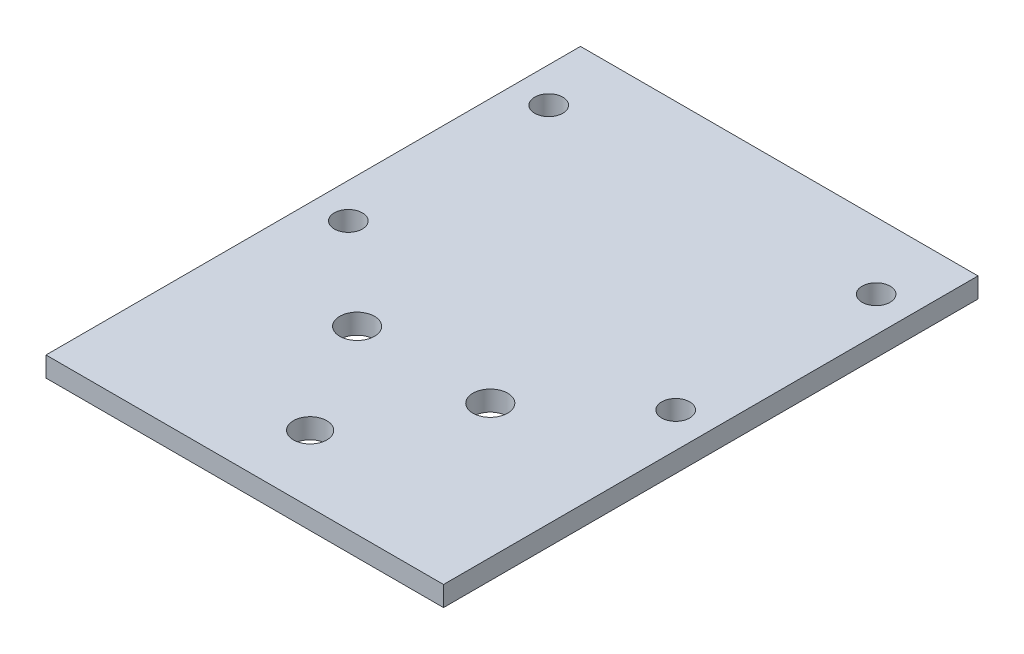
ISO-10303-21;
HEADER;
FILE_DESCRIPTION(('STEP AP214'),'2;1');
FILE_NAME('part.step','',(''),(''),'','','');
FILE_SCHEMA(('AUTOMOTIVE_DESIGN { 1 0 10303 214 1 1 1 1 }'));
ENDSEC;
DATA;
#1=APPLICATION_CONTEXT('core data for automotive mechanical design processes');
#2=APPLICATION_PROTOCOL_DEFINITION('international standard','automotive_design',2000,#1);
#3=PRODUCT_CONTEXT('',#1,'mechanical');
#4=PRODUCT('Part','Part','',(#3));
#5=PRODUCT_RELATED_PRODUCT_CATEGORY('part','',(#4));
#6=PRODUCT_DEFINITION_FORMATION('','',#4);
#7=PRODUCT_DEFINITION_CONTEXT('part definition',#1,'design');
#8=PRODUCT_DEFINITION('design','',#6,#7);
#9=PRODUCT_DEFINITION_SHAPE('','',#8);
#10=(LENGTH_UNIT() NAMED_UNIT(*) SI_UNIT(.MILLI.,.METRE.));
#11=(NAMED_UNIT(*) PLANE_ANGLE_UNIT() SI_UNIT($,.RADIAN.));
#12=(NAMED_UNIT(*) SI_UNIT($,.STERADIAN.) SOLID_ANGLE_UNIT());
#13=UNCERTAINTY_MEASURE_WITH_UNIT(LENGTH_MEASURE(1.E-05),#10,'distance_accuracy_value','');
#14=(GEOMETRIC_REPRESENTATION_CONTEXT(3) GLOBAL_UNCERTAINTY_ASSIGNED_CONTEXT((#13)) GLOBAL_UNIT_ASSIGNED_CONTEXT((#10,
#11,#12)) REPRESENTATION_CONTEXT('',''));
#15=CARTESIAN_POINT('',(0.,0.,0.));
#16=DIRECTION('',(0.,0.,1.));
#17=DIRECTION('',(1.,0.,0.));
#18=AXIS2_PLACEMENT_3D('',#15,#16,#17);
#19=CARTESIAN_POINT('',(0.,3.,0.));
#20=DIRECTION('',(0.,1.,0.));
#21=DIRECTION('',(0.,0.,1.));
#22=AXIS2_PLACEMENT_3D('',#19,#20,#21);
#23=PLANE('',#22);
#24=CARTESIAN_POINT('',(-0.216251762801351,3.,29.9999999999999));
#25=DIRECTION('',(0.,1.,0.));
#26=DIRECTION('',(0.,0.,1.));
#27=AXIS2_PLACEMENT_3D('',#24,#25,#26);
#28=CIRCLE('',#27,2.5);
#29=CARTESIAN_POINT('',(-0.216251762801351,3.,32.4999999999999));
#30=VERTEX_POINT('',#29);
#31=EDGE_CURVE('E145',#30,#30,#28,.T.);
#32=ORIENTED_EDGE('',*,*,#31,.F.);
#33=EDGE_LOOP('',(#32));
#34=FACE_BOUND('',#33,.T.);
#35=CARTESIAN_POINT('',(9.75000000000001,3.,12.9999999999999));
#36=DIRECTION('',(0.,1.,0.));
#37=DIRECTION('',(0.,0.,1.));
#38=AXIS2_PLACEMENT_3D('',#35,#36,#37);
#39=CIRCLE('',#38,2.6);
#40=CARTESIAN_POINT('',(9.75000000000001,3.,15.5999999999999));
#41=VERTEX_POINT('',#40);
#42=EDGE_CURVE('E133',#41,#41,#39,.T.);
#43=ORIENTED_EDGE('',*,*,#42,.F.);
#44=EDGE_LOOP('',(#43));
#45=FACE_BOUND('',#44,.T.);
#46=CARTESIAN_POINT('',(-24.5,3.,0.));
#47=DIRECTION('',(0.,1.,0.));
#48=DIRECTION('',(0.,0.,-1.));
#49=AXIS2_PLACEMENT_3D('',#46,#47,#48);
#50=CIRCLE('',#49,2.1);
#51=CARTESIAN_POINT('',(-24.5,3.,-2.09999999999999));
#52=VERTEX_POINT('',#51);
#53=EDGE_CURVE('E121',#52,#52,#50,.T.);
#54=ORIENTED_EDGE('',*,*,#53,.F.);
#55=EDGE_LOOP('',(#54));
#56=FACE_BOUND('',#55,.T.);
#57=CARTESIAN_POINT('',(-24.5,3.,-30.));
#58=DIRECTION('',(0.,1.,0.));
#59=DIRECTION('',(0.,0.,1.));
#60=AXIS2_PLACEMENT_3D('',#57,#58,#59);
#61=CIRCLE('',#60,2.1);
#62=CARTESIAN_POINT('',(-24.5,3.,-27.9));
#63=VERTEX_POINT('',#62);
#64=EDGE_CURVE('E100',#63,#63,#61,.T.);
#65=ORIENTED_EDGE('',*,*,#64,.F.);
#66=EDGE_LOOP('',(#65));
#67=FACE_BOUND('',#66,.T.);
#68=DIRECTION('',(0.,0.,-1.));
#69=VECTOR('',#68,1.);
#70=CARTESIAN_POINT('',(29.75,3.,-40.));
#71=LINE('',#70,#69);
#72=CARTESIAN_POINT('',(29.75,3.,40.));
#73=VERTEX_POINT('',#72);
#74=CARTESIAN_POINT('',(29.75,3.,-40.));
#75=VERTEX_POINT('',#74);
#76=EDGE_CURVE('E85',#73,#75,#71,.T.);
#77=ORIENTED_EDGE('',*,*,#76,.T.);
#78=DIRECTION('',(-1.,0.,0.));
#79=VECTOR('',#78,1.);
#80=CARTESIAN_POINT('',(-29.75,3.,-40.));
#81=LINE('',#80,#79);
#82=CARTESIAN_POINT('',(-29.75,3.,-40.));
#83=VERTEX_POINT('',#82);
#84=EDGE_CURVE('E80',#75,#83,#81,.T.);
#85=ORIENTED_EDGE('',*,*,#84,.T.);
#86=DIRECTION('',(0.,0.,1.));
#87=VECTOR('',#86,1.);
#88=CARTESIAN_POINT('',(-29.75,3.,-40.));
#89=LINE('',#88,#87);
#90=CARTESIAN_POINT('',(-29.75,3.,40.));
#91=VERTEX_POINT('',#90);
#92=EDGE_CURVE('E83',#83,#91,#89,.T.);
#93=ORIENTED_EDGE('',*,*,#92,.T.);
#94=DIRECTION('',(1.,0.,0.));
#95=VECTOR('',#94,1.);
#96=CARTESIAN_POINT('',(-29.75,3.,40.));
#97=LINE('',#96,#95);
#98=EDGE_CURVE('E50',#91,#73,#97,.T.);
#99=ORIENTED_EDGE('',*,*,#98,.T.);
#100=EDGE_LOOP('',(#77,#85,#93,#99));
#101=FACE_BOUND('',#100,.T.);
#102=CARTESIAN_POINT('',(24.5,3.,-30.));
#103=DIRECTION('',(0.,1.,0.));
#104=DIRECTION('',(0.,0.,-1.));
#105=AXIS2_PLACEMENT_3D('',#102,#103,#104);
#106=CIRCLE('',#105,2.1);
#107=CARTESIAN_POINT('',(24.5,3.,-32.1));
#108=VERTEX_POINT('',#107);
#109=EDGE_CURVE('E115',#108,#108,#106,.T.);
#110=ORIENTED_EDGE('',*,*,#109,.F.);
#111=EDGE_LOOP('',(#110));
#112=FACE_BOUND('',#111,.T.);
#113=CARTESIAN_POINT('',(24.5,3.,0.));
#114=DIRECTION('',(0.,1.,0.));
#115=DIRECTION('',(0.,0.,1.));
#116=AXIS2_PLACEMENT_3D('',#113,#114,#115);
#117=CIRCLE('',#116,2.1);
#118=CARTESIAN_POINT('',(24.5,3.,2.1));
#119=VERTEX_POINT('',#118);
#120=EDGE_CURVE('E127',#119,#119,#117,.T.);
#121=ORIENTED_EDGE('',*,*,#120,.F.);
#122=EDGE_LOOP('',(#121));
#123=FACE_BOUND('',#122,.T.);
#124=CARTESIAN_POINT('',(-10.1825035256027,3.,12.9999999999999));
#125=DIRECTION('',(0.,1.,0.));
#126=DIRECTION('',(0.,0.,1.));
#127=AXIS2_PLACEMENT_3D('',#124,#125,#126);
#128=CIRCLE('',#127,2.6);
#129=CARTESIAN_POINT('',(-10.1825035256027,3.,15.5999999999999));
#130=VERTEX_POINT('',#129);
#131=EDGE_CURVE('E139',#130,#130,#128,.T.);
#132=ORIENTED_EDGE('',*,*,#131,.F.);
#133=EDGE_LOOP('',(#132));
#134=FACE_BOUND('',#133,.T.);
#135=ADVANCED_FACE('F33',(#34,#45,#56,#67,#101,#112,#123,#134),#23,.T.);
#136=CARTESIAN_POINT('',(0.,0.,0.));
#137=DIRECTION('',(0.,1.,0.));
#138=DIRECTION('',(0.,0.,1.));
#139=AXIS2_PLACEMENT_3D('',#136,#137,#138);
#140=PLANE('',#139);
#141=CARTESIAN_POINT('',(-0.216251762801351,0.,29.9999999999999));
#142=DIRECTION('',(0.,-1.,0.));
#143=DIRECTION('',(0.,0.,-1.));
#144=AXIS2_PLACEMENT_3D('',#141,#142,#143);
#145=CIRCLE('',#144,2.5);
#146=CARTESIAN_POINT('',(-0.216251762801351,0.,27.4999999999999));
#147=VERTEX_POINT('',#146);
#148=EDGE_CURVE('E150',#147,#147,#145,.T.);
#149=ORIENTED_EDGE('',*,*,#148,.F.);
#150=EDGE_LOOP('',(#149));
#151=FACE_BOUND('',#150,.T.);
#152=DIRECTION('',(0.,0.,-1.));
#153=VECTOR('',#152,1.);
#154=CARTESIAN_POINT('',(29.75,0.,-40.));
#155=LINE('',#154,#153);
#156=CARTESIAN_POINT('',(29.75,0.,40.));
#157=VERTEX_POINT('',#156);
#158=CARTESIAN_POINT('',(29.75,0.,-40.));
#159=VERTEX_POINT('',#158);
#160=EDGE_CURVE('E97',#157,#159,#155,.T.);
#161=ORIENTED_EDGE('',*,*,#160,.F.);
#162=DIRECTION('',(1.,0.,0.));
#163=VECTOR('',#162,1.);
#164=CARTESIAN_POINT('',(-29.75,0.,40.));
#165=LINE('',#164,#163);
#166=CARTESIAN_POINT('',(-29.75,0.,40.));
#167=VERTEX_POINT('',#166);
#168=EDGE_CURVE('E73',#167,#157,#165,.T.);
#169=ORIENTED_EDGE('',*,*,#168,.F.);
#170=DIRECTION('',(0.,0.,1.));
#171=VECTOR('',#170,1.);
#172=CARTESIAN_POINT('',(-29.75,0.,-40.));
#173=LINE('',#172,#171);
#174=CARTESIAN_POINT('',(-29.75,0.,-40.));
#175=VERTEX_POINT('',#174);
#176=EDGE_CURVE('E67',#175,#167,#173,.T.);
#177=ORIENTED_EDGE('',*,*,#176,.F.);
#178=DIRECTION('',(-1.,0.,0.));
#179=VECTOR('',#178,1.);
#180=CARTESIAN_POINT('',(-29.75,0.,-40.));
#181=LINE('',#180,#179);
#182=EDGE_CURVE('E89',#159,#175,#181,.T.);
#183=ORIENTED_EDGE('',*,*,#182,.F.);
#184=EDGE_LOOP('',(#161,#169,#177,#183));
#185=FACE_BOUND('',#184,.T.);
#186=CARTESIAN_POINT('',(-24.5,0.,-30.));
#187=DIRECTION('',(0.,1.,0.));
#188=DIRECTION('',(0.,0.,1.));
#189=AXIS2_PLACEMENT_3D('',#186,#187,#188);
#190=CIRCLE('',#189,2.1);
#191=CARTESIAN_POINT('',(-24.5,0.,-27.9));
#192=VERTEX_POINT('',#191);
#193=EDGE_CURVE('E112',#192,#192,#190,.T.);
#194=ORIENTED_EDGE('',*,*,#193,.T.);
#195=EDGE_LOOP('',(#194));
#196=FACE_BOUND('',#195,.T.);
#197=CARTESIAN_POINT('',(24.5,0.,-30.));
#198=DIRECTION('',(0.,1.,0.));
#199=DIRECTION('',(0.,0.,-1.));
#200=AXIS2_PLACEMENT_3D('',#197,#198,#199);
#201=CIRCLE('',#200,2.1);
#202=CARTESIAN_POINT('',(24.5,0.,-32.1));
#203=VERTEX_POINT('',#202);
#204=EDGE_CURVE('E118',#203,#203,#201,.T.);
#205=ORIENTED_EDGE('',*,*,#204,.T.);
#206=EDGE_LOOP('',(#205));
#207=FACE_BOUND('',#206,.T.);
#208=CARTESIAN_POINT('',(-24.5,0.,0.));
#209=DIRECTION('',(0.,1.,0.));
#210=DIRECTION('',(0.,0.,-1.));
#211=AXIS2_PLACEMENT_3D('',#208,#209,#210);
#212=CIRCLE('',#211,2.1);
#213=CARTESIAN_POINT('',(-24.5,0.,-2.09999999999999));
#214=VERTEX_POINT('',#213);
#215=EDGE_CURVE('E124',#214,#214,#212,.T.);
#216=ORIENTED_EDGE('',*,*,#215,.T.);
#217=EDGE_LOOP('',(#216));
#218=FACE_BOUND('',#217,.T.);
#219=CARTESIAN_POINT('',(24.5,0.,0.));
#220=DIRECTION('',(0.,1.,0.));
#221=DIRECTION('',(0.,0.,1.));
#222=AXIS2_PLACEMENT_3D('',#219,#220,#221);
#223=CIRCLE('',#222,2.1);
#224=CARTESIAN_POINT('',(24.5,0.,2.1));
#225=VERTEX_POINT('',#224);
#226=EDGE_CURVE('E130',#225,#225,#223,.T.);
#227=ORIENTED_EDGE('',*,*,#226,.T.);
#228=EDGE_LOOP('',(#227));
#229=FACE_BOUND('',#228,.T.);
#230=CARTESIAN_POINT('',(9.75000000000001,0.,12.9999999999999));
#231=DIRECTION('',(0.,1.,0.));
#232=DIRECTION('',(0.,0.,1.));
#233=AXIS2_PLACEMENT_3D('',#230,#231,#232);
#234=CIRCLE('',#233,2.6);
#235=CARTESIAN_POINT('',(9.75000000000001,0.,15.5999999999999));
#236=VERTEX_POINT('',#235);
#237=EDGE_CURVE('E136',#236,#236,#234,.T.);
#238=ORIENTED_EDGE('',*,*,#237,.T.);
#239=EDGE_LOOP('',(#238));
#240=FACE_BOUND('',#239,.T.);
#241=CARTESIAN_POINT('',(-10.1825035256027,0.,12.9999999999999));
#242=DIRECTION('',(0.,1.,0.));
#243=DIRECTION('',(0.,0.,1.));
#244=AXIS2_PLACEMENT_3D('',#241,#242,#243);
#245=CIRCLE('',#244,2.6);
#246=CARTESIAN_POINT('',(-10.1825035256027,0.,15.5999999999999));
#247=VERTEX_POINT('',#246);
#248=EDGE_CURVE('E142',#247,#247,#245,.T.);
#249=ORIENTED_EDGE('',*,*,#248,.T.);
#250=EDGE_LOOP('',(#249));
#251=FACE_BOUND('',#250,.T.);
#252=ADVANCED_FACE('F108',(#151,#185,#196,#207,#218,#229,#240,#251),#140,.F.);
#253=CARTESIAN_POINT('',(29.75,3.,-40.));
#254=DIRECTION('',(-1.,0.,0.));
#255=DIRECTION('',(0.,0.,1.));
#256=AXIS2_PLACEMENT_3D('',#253,#254,#255);
#257=PLANE('',#256);
#258=ORIENTED_EDGE('',*,*,#160,.T.);
#259=DIRECTION('',(0.,-1.,0.));
#260=VECTOR('',#259,1.);
#261=CARTESIAN_POINT('',(29.75,3.,-40.));
#262=LINE('',#261,#260);
#263=EDGE_CURVE('E11',#75,#159,#262,.T.);
#264=ORIENTED_EDGE('',*,*,#263,.F.);
#265=ORIENTED_EDGE('',*,*,#76,.F.);
#266=DIRECTION('',(0.,-1.,0.));
#267=VECTOR('',#266,1.);
#268=CARTESIAN_POINT('',(29.75,3.,40.));
#269=LINE('',#268,#267);
#270=EDGE_CURVE('E93',#73,#157,#269,.T.);
#271=ORIENTED_EDGE('',*,*,#270,.T.);
#272=EDGE_LOOP('',(#258,#264,#265,#271));
#273=FACE_BOUND('',#272,.T.);
#274=ADVANCED_FACE('F35',(#273),#257,.F.);
#275=CARTESIAN_POINT('',(-29.75,3.,-40.));
#276=DIRECTION('',(0.,0.,1.));
#277=DIRECTION('',(1.,0.,0.));
#278=AXIS2_PLACEMENT_3D('',#275,#276,#277);
#279=PLANE('',#278);
#280=ORIENTED_EDGE('',*,*,#182,.T.);
#281=DIRECTION('',(0.,-1.,0.));
#282=VECTOR('',#281,1.);
#283=CARTESIAN_POINT('',(-29.75,3.,-40.));
#284=LINE('',#283,#282);
#285=EDGE_CURVE('E42',#83,#175,#284,.T.);
#286=ORIENTED_EDGE('',*,*,#285,.F.);
#287=ORIENTED_EDGE('',*,*,#84,.F.);
#288=ORIENTED_EDGE('',*,*,#263,.T.);
#289=EDGE_LOOP('',(#280,#286,#287,#288));
#290=FACE_BOUND('',#289,.T.);
#291=ADVANCED_FACE('F88',(#290),#279,.F.);
#292=CARTESIAN_POINT('',(-29.75,3.,-40.));
#293=DIRECTION('',(1.,0.,0.));
#294=DIRECTION('',(0.,0.,-1.));
#295=AXIS2_PLACEMENT_3D('',#292,#293,#294);
#296=PLANE('',#295);
#297=ORIENTED_EDGE('',*,*,#176,.T.);
#298=DIRECTION('',(0.,-1.,0.));
#299=VECTOR('',#298,1.);
#300=CARTESIAN_POINT('',(-29.75,3.,40.));
#301=LINE('',#300,#299);
#302=EDGE_CURVE('E90',#91,#167,#301,.T.);
#303=ORIENTED_EDGE('',*,*,#302,.F.);
#304=ORIENTED_EDGE('',*,*,#92,.F.);
#305=ORIENTED_EDGE('',*,*,#285,.T.);
#306=EDGE_LOOP('',(#297,#303,#304,#305));
#307=FACE_BOUND('',#306,.T.);
#308=ADVANCED_FACE('F91',(#307),#296,.F.);
#309=CARTESIAN_POINT('',(-29.75,3.,40.));
#310=DIRECTION('',(0.,0.,-1.));
#311=DIRECTION('',(-1.,0.,0.));
#312=AXIS2_PLACEMENT_3D('',#309,#310,#311);
#313=PLANE('',#312);
#314=ORIENTED_EDGE('',*,*,#168,.T.);
#315=ORIENTED_EDGE('',*,*,#270,.F.);
#316=ORIENTED_EDGE('',*,*,#98,.F.);
#317=ORIENTED_EDGE('',*,*,#302,.T.);
#318=EDGE_LOOP('',(#314,#315,#316,#317));
#319=FACE_BOUND('',#318,.T.);
#320=ADVANCED_FACE('F105',(#319),#313,.F.);
#321=CARTESIAN_POINT('',(-24.5,3.,-30.));
#322=DIRECTION('',(0.,-1.,0.));
#323=DIRECTION('',(0.,0.,-1.));
#324=AXIS2_PLACEMENT_3D('',#321,#322,#323);
#325=CYLINDRICAL_SURFACE('',#324,2.1);
#326=ORIENTED_EDGE('',*,*,#64,.T.);
#327=EDGE_LOOP('',(#326));
#328=FACE_BOUND('',#327,.T.);
#329=ORIENTED_EDGE('',*,*,#193,.F.);
#330=EDGE_LOOP('',(#329));
#331=FACE_BOUND('',#330,.T.);
#332=ADVANCED_FACE('F168',(#328,#331),#325,.F.);
#333=CARTESIAN_POINT('',(24.5,3.,-30.));
#334=DIRECTION('',(0.,-1.,0.));
#335=DIRECTION('',(0.,0.,-1.));
#336=AXIS2_PLACEMENT_3D('',#333,#334,#335);
#337=CYLINDRICAL_SURFACE('',#336,2.1);
#338=ORIENTED_EDGE('',*,*,#109,.T.);
#339=EDGE_LOOP('',(#338));
#340=FACE_BOUND('',#339,.T.);
#341=ORIENTED_EDGE('',*,*,#204,.F.);
#342=EDGE_LOOP('',(#341));
#343=FACE_BOUND('',#342,.T.);
#344=ADVANCED_FACE('F189',(#340,#343),#337,.F.);
#345=CARTESIAN_POINT('',(-24.5,3.,0.));
#346=DIRECTION('',(0.,-1.,0.));
#347=DIRECTION('',(0.,0.,-1.));
#348=AXIS2_PLACEMENT_3D('',#345,#346,#347);
#349=CYLINDRICAL_SURFACE('',#348,2.1);
#350=ORIENTED_EDGE('',*,*,#53,.T.);
#351=EDGE_LOOP('',(#350));
#352=FACE_BOUND('',#351,.T.);
#353=ORIENTED_EDGE('',*,*,#215,.F.);
#354=EDGE_LOOP('',(#353));
#355=FACE_BOUND('',#354,.T.);
#356=ADVANCED_FACE('F196',(#352,#355),#349,.F.);
#357=CARTESIAN_POINT('',(24.5,3.,0.));
#358=DIRECTION('',(0.,-1.,0.));
#359=DIRECTION('',(0.,0.,-1.));
#360=AXIS2_PLACEMENT_3D('',#357,#358,#359);
#361=CYLINDRICAL_SURFACE('',#360,2.1);
#362=ORIENTED_EDGE('',*,*,#120,.T.);
#363=EDGE_LOOP('',(#362));
#364=FACE_BOUND('',#363,.T.);
#365=ORIENTED_EDGE('',*,*,#226,.F.);
#366=EDGE_LOOP('',(#365));
#367=FACE_BOUND('',#366,.T.);
#368=ADVANCED_FACE('F204',(#364,#367),#361,.F.);
#369=CARTESIAN_POINT('',(9.75000000000001,3.,12.9999999999999));
#370=DIRECTION('',(0.,-1.,0.));
#371=DIRECTION('',(0.,0.,-1.));
#372=AXIS2_PLACEMENT_3D('',#369,#370,#371);
#373=CYLINDRICAL_SURFACE('',#372,2.6);
#374=ORIENTED_EDGE('',*,*,#42,.T.);
#375=EDGE_LOOP('',(#374));
#376=FACE_BOUND('',#375,.T.);
#377=ORIENTED_EDGE('',*,*,#237,.F.);
#378=EDGE_LOOP('',(#377));
#379=FACE_BOUND('',#378,.T.);
#380=ADVANCED_FACE('F212',(#376,#379),#373,.F.);
#381=CARTESIAN_POINT('',(-10.1825035256027,3.,12.9999999999999));
#382=DIRECTION('',(0.,-1.,0.));
#383=DIRECTION('',(0.,0.,-1.));
#384=AXIS2_PLACEMENT_3D('',#381,#382,#383);
#385=CYLINDRICAL_SURFACE('',#384,2.6);
#386=ORIENTED_EDGE('',*,*,#131,.T.);
#387=EDGE_LOOP('',(#386));
#388=FACE_BOUND('',#387,.T.);
#389=ORIENTED_EDGE('',*,*,#248,.F.);
#390=EDGE_LOOP('',(#389));
#391=FACE_BOUND('',#390,.T.);
#392=ADVANCED_FACE('F220',(#388,#391),#385,.F.);
#393=CARTESIAN_POINT('',(-0.216251762801351,10.,29.9999999999999));
#394=DIRECTION('',(0.,-1.,0.));
#395=DIRECTION('',(0.,0.,-1.));
#396=AXIS2_PLACEMENT_3D('',#393,#394,#395);
#397=CYLINDRICAL_SURFACE('',#396,2.5);
#398=ORIENTED_EDGE('',*,*,#31,.T.);
#399=EDGE_LOOP('',(#398));
#400=FACE_BOUND('',#399,.T.);
#401=ORIENTED_EDGE('',*,*,#148,.T.);
#402=EDGE_LOOP('',(#401));
#403=FACE_BOUND('',#402,.T.);
#404=ADVANCED_FACE('F154',(#400,#403),#397,.F.);
#405=CLOSED_SHELL('',(#135,#252,#274,#291,#308,#320,#332,#344,#356,#368,#380,#392,#404));
#406=MANIFOLD_SOLID_BREP('B2',#405);
#407=ADVANCED_BREP_SHAPE_REPRESENTATION('',(#18,#406),#14);
#408=SHAPE_DEFINITION_REPRESENTATION(#9,#407);
ENDSEC;
END-ISO-10303-21;
